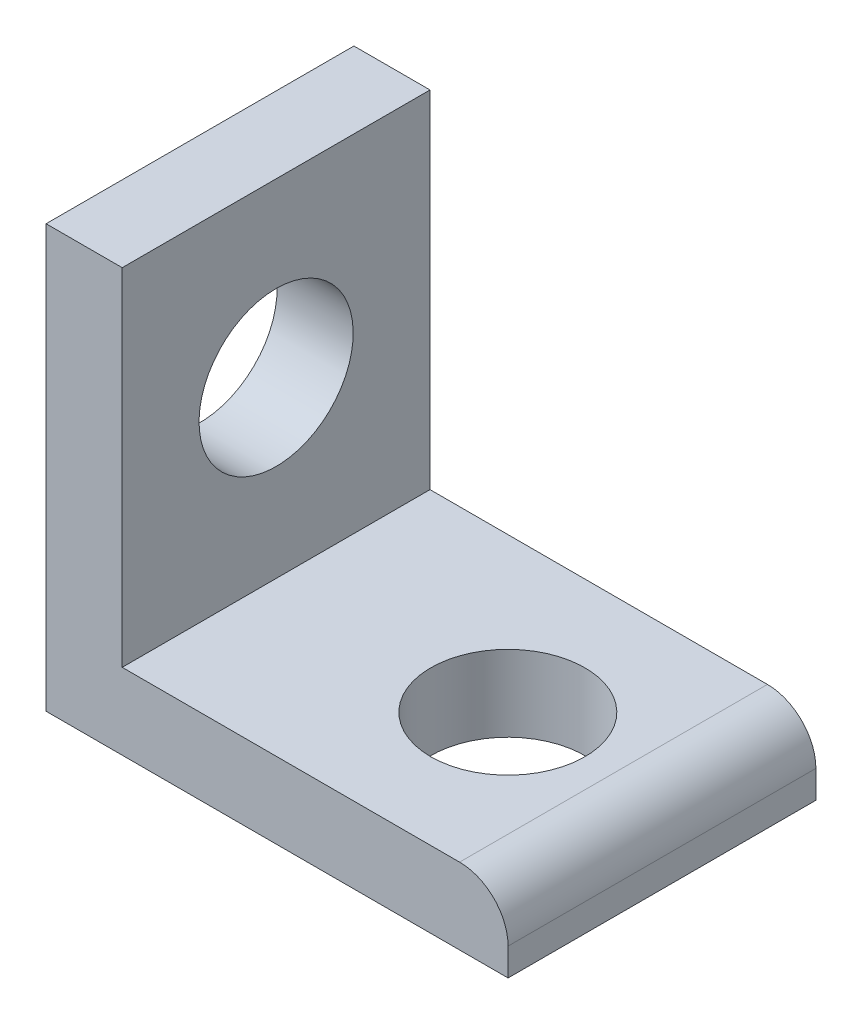
ISO-10303-21;
HEADER;
FILE_DESCRIPTION(('STEP AP214'),'2;1');
FILE_NAME('part.step','',(''),(''),'','','');
FILE_SCHEMA(('AUTOMOTIVE_DESIGN { 1 0 10303 214 1 1 1 1 }'));
ENDSEC;
DATA;
#1=APPLICATION_CONTEXT('core data for automotive mechanical design processes');
#2=APPLICATION_PROTOCOL_DEFINITION('international standard','automotive_design',2000,#1);
#3=PRODUCT_CONTEXT('',#1,'mechanical');
#4=PRODUCT('Part','Part','',(#3));
#5=PRODUCT_RELATED_PRODUCT_CATEGORY('part','',(#4));
#6=PRODUCT_DEFINITION_FORMATION('','',#4);
#7=PRODUCT_DEFINITION_CONTEXT('part definition',#1,'design');
#8=PRODUCT_DEFINITION('design','',#6,#7);
#9=PRODUCT_DEFINITION_SHAPE('','',#8);
#10=(LENGTH_UNIT() NAMED_UNIT(*) SI_UNIT(.MILLI.,.METRE.));
#11=(NAMED_UNIT(*) PLANE_ANGLE_UNIT() SI_UNIT($,.RADIAN.));
#12=(NAMED_UNIT(*) SI_UNIT($,.STERADIAN.) SOLID_ANGLE_UNIT());
#13=UNCERTAINTY_MEASURE_WITH_UNIT(LENGTH_MEASURE(1.E-05),#10,'distance_accuracy_value','');
#14=(GEOMETRIC_REPRESENTATION_CONTEXT(3) GLOBAL_UNCERTAINTY_ASSIGNED_CONTEXT((#13)) GLOBAL_UNIT_ASSIGNED_CONTEXT((#10,
#11,#12)) REPRESENTATION_CONTEXT('',''));
#15=CARTESIAN_POINT('',(0.,0.,0.));
#16=DIRECTION('',(0.,0.,1.));
#17=DIRECTION('',(1.,0.,0.));
#18=AXIS2_PLACEMENT_3D('',#15,#16,#17);
#19=CARTESIAN_POINT('',(0.,0.,6.35));
#20=DIRECTION('',(1.,0.,0.));
#21=DIRECTION('',(0.,0.,-1.));
#22=AXIS2_PLACEMENT_3D('',#19,#20,#21);
#23=PLANE('',#22);
#24=CARTESIAN_POINT('',(0.,5.16,3.175));
#25=DIRECTION('',(1.,0.,0.));
#26=DIRECTION('',(0.,0.,-1.));
#27=AXIS2_PLACEMENT_3D('',#24,#25,#26);
#28=CIRCLE('',#27,1.59);
#29=CARTESIAN_POINT('',(0.,6.75,3.175));
#30=VERTEX_POINT('',#29);
#31=EDGE_CURVE('E152',#30,#30,#28,.F.);
#32=ORIENTED_EDGE('',*,*,#31,.F.);
#33=EDGE_LOOP('',(#32));
#34=FACE_BOUND('',#33,.T.);
#35=DIRECTION('',(0.,-1.,0.));
#36=VECTOR('',#35,1.);
#37=CARTESIAN_POINT('',(0.,0.,0.));
#38=LINE('',#37,#36);
#39=CARTESIAN_POINT('',(0.,8.71,0.));
#40=VERTEX_POINT('',#39);
#41=CARTESIAN_POINT('',(0.,0.,0.));
#42=VERTEX_POINT('',#41);
#43=EDGE_CURVE('E114',#40,#42,#38,.T.);
#44=ORIENTED_EDGE('',*,*,#43,.T.);
#45=DIRECTION('',(0.,0.,-1.));
#46=VECTOR('',#45,1.);
#47=CARTESIAN_POINT('',(0.,0.,6.35));
#48=LINE('',#47,#46);
#49=CARTESIAN_POINT('',(0.,0.,6.35));
#50=VERTEX_POINT('',#49);
#51=EDGE_CURVE('E96',#50,#42,#48,.T.);
#52=ORIENTED_EDGE('',*,*,#51,.F.);
#53=DIRECTION('',(0.,-1.,0.));
#54=VECTOR('',#53,1.);
#55=CARTESIAN_POINT('',(0.,0.,6.35));
#56=LINE('',#55,#54);
#57=CARTESIAN_POINT('',(0.,8.71,6.35));
#58=VERTEX_POINT('',#57);
#59=EDGE_CURVE('E102',#58,#50,#56,.T.);
#60=ORIENTED_EDGE('',*,*,#59,.F.);
#61=DIRECTION('',(0.,0.,-1.));
#62=VECTOR('',#61,1.);
#63=CARTESIAN_POINT('',(0.,8.71,6.35));
#64=LINE('',#63,#62);
#65=EDGE_CURVE('E128',#58,#40,#64,.T.);
#66=ORIENTED_EDGE('',*,*,#65,.T.);
#67=EDGE_LOOP('',(#44,#52,#60,#66));
#68=FACE_BOUND('',#67,.T.);
#69=ADVANCED_FACE('F33',(#34,#68),#23,.F.);
#70=CARTESIAN_POINT('',(0.,0.,6.35));
#71=DIRECTION('',(0.,1.,0.));
#72=DIRECTION('',(0.,0.,1.));
#73=AXIS2_PLACEMENT_3D('',#70,#71,#72);
#74=PLANE('',#73);
#75=CARTESIAN_POINT('',(6.35,0.,3.175));
#76=DIRECTION('',(0.,1.,0.));
#77=DIRECTION('',(0.,0.,1.));
#78=AXIS2_PLACEMENT_3D('',#75,#76,#77);
#79=CIRCLE('',#78,1.59);
#80=CARTESIAN_POINT('',(6.35,0.,4.765));
#81=VERTEX_POINT('',#80);
#82=EDGE_CURVE('E140',#81,#81,#79,.F.);
#83=ORIENTED_EDGE('',*,*,#82,.F.);
#84=EDGE_LOOP('',(#83));
#85=FACE_BOUND('',#84,.T.);
#86=DIRECTION('',(1.,0.,0.));
#87=VECTOR('',#86,1.);
#88=CARTESIAN_POINT('',(0.,0.,0.));
#89=LINE('',#88,#87);
#90=CARTESIAN_POINT('',(9.53,0.,0.));
#91=VERTEX_POINT('',#90);
#92=EDGE_CURVE('E137',#42,#91,#89,.T.);
#93=ORIENTED_EDGE('',*,*,#92,.T.);
#94=DIRECTION('',(0.,0.,-1.));
#95=VECTOR('',#94,1.);
#96=CARTESIAN_POINT('',(9.53,0.,6.35));
#97=LINE('',#96,#95);
#98=CARTESIAN_POINT('',(9.53,0.,6.35));
#99=VERTEX_POINT('',#98);
#100=EDGE_CURVE('E99',#99,#91,#97,.T.);
#101=ORIENTED_EDGE('',*,*,#100,.F.);
#102=DIRECTION('',(1.,0.,0.));
#103=VECTOR('',#102,1.);
#104=CARTESIAN_POINT('',(0.,0.,6.35));
#105=LINE('',#104,#103);
#106=EDGE_CURVE('E92',#50,#99,#105,.T.);
#107=ORIENTED_EDGE('',*,*,#106,.F.);
#108=ORIENTED_EDGE('',*,*,#51,.T.);
#109=EDGE_LOOP('',(#93,#101,#107,#108));
#110=FACE_BOUND('',#109,.T.);
#111=ADVANCED_FACE('F94',(#85,#110),#74,.F.);
#112=CARTESIAN_POINT('',(9.53,1.57,6.35));
#113=DIRECTION('',(-1.,0.,0.));
#114=DIRECTION('',(0.,0.,1.));
#115=AXIS2_PLACEMENT_3D('',#112,#113,#114);
#116=PLANE('',#115);
#117=DIRECTION('',(0.,1.,0.));
#118=VECTOR('',#117,1.);
#119=CARTESIAN_POINT('',(9.53,1.57,0.));
#120=LINE('',#119,#118);
#121=CARTESIAN_POINT('',(9.53,0.57,0.));
#122=VERTEX_POINT('',#121);
#123=EDGE_CURVE('E135',#91,#122,#120,.T.);
#124=ORIENTED_EDGE('',*,*,#123,.T.);
#125=DIRECTION('',(0.,0.,-1.));
#126=VECTOR('',#125,1.);
#127=CARTESIAN_POINT('',(9.53,0.57,6.35));
#128=LINE('',#127,#126);
#129=CARTESIAN_POINT('',(9.53,0.57,6.35));
#130=VERTEX_POINT('',#129);
#131=EDGE_CURVE('E41',#122,#130,#128,.F.);
#132=ORIENTED_EDGE('',*,*,#131,.T.);
#133=DIRECTION('',(0.,1.,0.));
#134=VECTOR('',#133,1.);
#135=CARTESIAN_POINT('',(9.53,1.57,6.35));
#136=LINE('',#135,#134);
#137=EDGE_CURVE('E101',#99,#130,#136,.T.);
#138=ORIENTED_EDGE('',*,*,#137,.F.);
#139=ORIENTED_EDGE('',*,*,#100,.T.);
#140=EDGE_LOOP('',(#124,#132,#138,#139));
#141=FACE_BOUND('',#140,.T.);
#142=ADVANCED_FACE('F174',(#141),#116,.F.);
#143=CARTESIAN_POINT('',(1.57,1.57,6.35));
#144=DIRECTION('',(0.,-1.,0.));
#145=DIRECTION('',(0.,0.,-1.));
#146=AXIS2_PLACEMENT_3D('',#143,#144,#145);
#147=PLANE('',#146);
#148=CARTESIAN_POINT('',(6.35,1.57,3.175));
#149=DIRECTION('',(0.,1.,0.));
#150=DIRECTION('',(0.,0.,1.));
#151=AXIS2_PLACEMENT_3D('',#148,#149,#150);
#152=CIRCLE('',#151,1.59);
#153=CARTESIAN_POINT('',(6.35,1.57,4.765));
#154=VERTEX_POINT('',#153);
#155=EDGE_CURVE('E149',#154,#154,#152,.T.);
#156=ORIENTED_EDGE('',*,*,#155,.F.);
#157=EDGE_LOOP('',(#156));
#158=FACE_BOUND('',#157,.T.);
#159=DIRECTION('',(-1.,0.,0.));
#160=VECTOR('',#159,1.);
#161=CARTESIAN_POINT('',(1.57,1.57,6.35));
#162=LINE('',#161,#160);
#163=CARTESIAN_POINT('',(8.53,1.57,6.35));
#164=VERTEX_POINT('',#163);
#165=CARTESIAN_POINT('',(1.57,1.57,6.35));
#166=VERTEX_POINT('',#165);
#167=EDGE_CURVE('E144',#164,#166,#162,.T.);
#168=ORIENTED_EDGE('',*,*,#167,.F.);
#169=DIRECTION('',(0.,0.,-1.));
#170=VECTOR('',#169,1.);
#171=CARTESIAN_POINT('',(8.53,1.57,6.35));
#172=LINE('',#171,#170);
#173=CARTESIAN_POINT('',(8.53,1.57,0.));
#174=VERTEX_POINT('',#173);
#175=EDGE_CURVE('E115',#164,#174,#172,.T.);
#176=ORIENTED_EDGE('',*,*,#175,.T.);
#177=DIRECTION('',(-1.,0.,0.));
#178=VECTOR('',#177,1.);
#179=CARTESIAN_POINT('',(1.57,1.57,0.));
#180=LINE('',#179,#178);
#181=CARTESIAN_POINT('',(1.57,1.57,0.));
#182=VERTEX_POINT('',#181);
#183=EDGE_CURVE('E133',#174,#182,#180,.T.);
#184=ORIENTED_EDGE('',*,*,#183,.T.);
#185=DIRECTION('',(0.,0.,-1.));
#186=VECTOR('',#185,1.);
#187=CARTESIAN_POINT('',(1.57,1.57,6.35));
#188=LINE('',#187,#186);
#189=EDGE_CURVE('E119',#166,#182,#188,.T.);
#190=ORIENTED_EDGE('',*,*,#189,.F.);
#191=EDGE_LOOP('',(#168,#176,#184,#190));
#192=FACE_BOUND('',#191,.T.);
#193=ADVANCED_FACE('F165',(#158,#192),#147,.F.);
#194=CARTESIAN_POINT('',(1.57,8.71,6.35));
#195=DIRECTION('',(-1.,0.,0.));
#196=DIRECTION('',(0.,-1.,0.));
#197=AXIS2_PLACEMENT_3D('',#194,#195,#196);
#198=PLANE('',#197);
#199=CARTESIAN_POINT('',(1.57,5.16,3.175));
#200=DIRECTION('',(1.,0.,0.));
#201=DIRECTION('',(0.,1.,0.));
#202=AXIS2_PLACEMENT_3D('',#199,#200,#201);
#203=CIRCLE('',#202,1.59);
#204=CARTESIAN_POINT('',(1.57,6.75,3.175));
#205=VERTEX_POINT('',#204);
#206=EDGE_CURVE('E155',#205,#205,#203,.T.);
#207=ORIENTED_EDGE('',*,*,#206,.F.);
#208=EDGE_LOOP('',(#207));
#209=FACE_BOUND('',#208,.T.);
#210=DIRECTION('',(0.,1.,0.));
#211=VECTOR('',#210,1.);
#212=CARTESIAN_POINT('',(1.57,8.71,0.));
#213=LINE('',#212,#211);
#214=CARTESIAN_POINT('',(1.57,8.71,0.));
#215=VERTEX_POINT('',#214);
#216=EDGE_CURVE('E131',#182,#215,#213,.T.);
#217=ORIENTED_EDGE('',*,*,#216,.T.);
#218=DIRECTION('',(0.,0.,-1.));
#219=VECTOR('',#218,1.);
#220=CARTESIAN_POINT('',(1.57,8.71,6.35));
#221=LINE('',#220,#219);
#222=CARTESIAN_POINT('',(1.57,8.71,6.35));
#223=VERTEX_POINT('',#222);
#224=EDGE_CURVE('E125',#223,#215,#221,.T.);
#225=ORIENTED_EDGE('',*,*,#224,.F.);
#226=DIRECTION('',(0.,1.,0.));
#227=VECTOR('',#226,1.);
#228=CARTESIAN_POINT('',(1.57,8.71,6.35));
#229=LINE('',#228,#227);
#230=EDGE_CURVE('E142',#166,#223,#229,.T.);
#231=ORIENTED_EDGE('',*,*,#230,.F.);
#232=ORIENTED_EDGE('',*,*,#189,.T.);
#233=EDGE_LOOP('',(#217,#225,#231,#232));
#234=FACE_BOUND('',#233,.T.);
#235=ADVANCED_FACE('F161',(#209,#234),#198,.F.);
#236=CARTESIAN_POINT('',(0.,8.71,6.35));
#237=DIRECTION('',(0.,-1.,0.));
#238=DIRECTION('',(0.,0.,-1.));
#239=AXIS2_PLACEMENT_3D('',#236,#237,#238);
#240=PLANE('',#239);
#241=DIRECTION('',(-1.,0.,0.));
#242=VECTOR('',#241,1.);
#243=CARTESIAN_POINT('',(0.,8.71,0.));
#244=LINE('',#243,#242);
#245=EDGE_CURVE('E111',#215,#40,#244,.T.);
#246=ORIENTED_EDGE('',*,*,#245,.T.);
#247=ORIENTED_EDGE('',*,*,#65,.F.);
#248=DIRECTION('',(-1.,0.,0.));
#249=VECTOR('',#248,1.);
#250=CARTESIAN_POINT('',(0.,8.71,6.35));
#251=LINE('',#250,#249);
#252=EDGE_CURVE('E107',#223,#58,#251,.T.);
#253=ORIENTED_EDGE('',*,*,#252,.F.);
#254=ORIENTED_EDGE('',*,*,#224,.T.);
#255=EDGE_LOOP('',(#246,#247,#253,#254));
#256=FACE_BOUND('',#255,.T.);
#257=ADVANCED_FACE('F164',(#256),#240,.F.);
#258=CARTESIAN_POINT('',(0.,0.,6.35));
#259=DIRECTION('',(0.,0.,-1.));
#260=DIRECTION('',(-1.,0.,0.));
#261=AXIS2_PLACEMENT_3D('',#258,#259,#260);
#262=PLANE('',#261);
#263=ORIENTED_EDGE('',*,*,#137,.T.);
#264=CARTESIAN_POINT('',(8.53,0.57,6.35));
#265=DIRECTION('',(0.,0.,-1.));
#266=DIRECTION('',(-1.,0.,0.));
#267=AXIS2_PLACEMENT_3D('',#264,#265,#266);
#268=CIRCLE('',#267,1.);
#269=EDGE_CURVE('E11',#130,#164,#268,.F.);
#270=ORIENTED_EDGE('',*,*,#269,.T.);
#271=ORIENTED_EDGE('',*,*,#167,.T.);
#272=ORIENTED_EDGE('',*,*,#230,.T.);
#273=ORIENTED_EDGE('',*,*,#252,.T.);
#274=ORIENTED_EDGE('',*,*,#59,.T.);
#275=ORIENTED_EDGE('',*,*,#106,.T.);
#276=EDGE_LOOP('',(#263,#270,#271,#272,#273,#274,#275));
#277=FACE_BOUND('',#276,.T.);
#278=ADVANCED_FACE('F105',(#277),#262,.F.);
#279=CARTESIAN_POINT('',(0.,0.,0.));
#280=DIRECTION('',(0.,0.,-1.));
#281=DIRECTION('',(-1.,0.,0.));
#282=AXIS2_PLACEMENT_3D('',#279,#280,#281);
#283=PLANE('',#282);
#284=ORIENTED_EDGE('',*,*,#183,.F.);
#285=CARTESIAN_POINT('',(8.53,0.57,0.));
#286=DIRECTION('',(0.,0.,-1.));
#287=DIRECTION('',(-1.,0.,0.));
#288=AXIS2_PLACEMENT_3D('',#285,#286,#287);
#289=CIRCLE('',#288,1.);
#290=EDGE_CURVE('E55',#174,#122,#289,.T.);
#291=ORIENTED_EDGE('',*,*,#290,.T.);
#292=ORIENTED_EDGE('',*,*,#123,.F.);
#293=ORIENTED_EDGE('',*,*,#92,.F.);
#294=ORIENTED_EDGE('',*,*,#43,.F.);
#295=ORIENTED_EDGE('',*,*,#245,.F.);
#296=ORIENTED_EDGE('',*,*,#216,.F.);
#297=EDGE_LOOP('',(#284,#291,#292,#293,#294,#295,#296));
#298=FACE_BOUND('',#297,.T.);
#299=ADVANCED_FACE('F173',(#298),#283,.T.);
#300=CARTESIAN_POINT('',(6.35,-4.49719912834644,3.175));
#301=DIRECTION('',(0.,1.,0.));
#302=DIRECTION('',(0.,0.,1.));
#303=AXIS2_PLACEMENT_3D('',#300,#301,#302);
#304=CYLINDRICAL_SURFACE('',#303,1.59);
#305=ORIENTED_EDGE('',*,*,#82,.T.);
#306=EDGE_LOOP('',(#305));
#307=FACE_BOUND('',#306,.T.);
#308=ORIENTED_EDGE('',*,*,#155,.T.);
#309=EDGE_LOOP('',(#308));
#310=FACE_BOUND('',#309,.T.);
#311=ADVANCED_FACE('F198',(#307,#310),#304,.F.);
#312=CARTESIAN_POINT('',(-4.49719912834644,5.16,3.175));
#313=DIRECTION('',(1.,0.,0.));
#314=DIRECTION('',(0.,1.,0.));
#315=AXIS2_PLACEMENT_3D('',#312,#313,#314);
#316=CYLINDRICAL_SURFACE('',#315,1.59);
#317=CARTESIAN_POINT('',(0.,6.75,3.175));
#318=CARTESIAN_POINT('',(0.0163541666666665,6.75,3.175));
#319=CARTESIAN_POINT('',(0.0327083333333331,6.75,3.175));
#320=CARTESIAN_POINT('',(0.0654166666666665,6.75,3.175));
#321=CARTESIAN_POINT('',(0.0817708333333333,6.75,3.175));
#322=CARTESIAN_POINT('',(0.114479166666667,6.75,3.175));
#323=CARTESIAN_POINT('',(0.130833333333333,6.75,3.175));
#324=CARTESIAN_POINT('',(0.163541666666667,6.75,3.175));
#325=CARTESIAN_POINT('',(0.179895833333333,6.75,3.175));
#326=CARTESIAN_POINT('',(0.212604166666667,6.75,3.175));
#327=CARTESIAN_POINT('',(0.228958333333333,6.75,3.175));
#328=CARTESIAN_POINT('',(0.261666666666667,6.75,3.175));
#329=CARTESIAN_POINT('',(0.278020833333333,6.75,3.175));
#330=CARTESIAN_POINT('',(0.310729166666667,6.75,3.175));
#331=CARTESIAN_POINT('',(0.327083333333333,6.75,3.175));
#332=CARTESIAN_POINT('',(0.359791666666667,6.75,3.175));
#333=CARTESIAN_POINT('',(0.376145833333334,6.75,3.175));
#334=CARTESIAN_POINT('',(0.408854166666667,6.75,3.175));
#335=CARTESIAN_POINT('',(0.425208333333334,6.75,3.175));
#336=CARTESIAN_POINT('',(0.457916666666667,6.75,3.175));
#337=CARTESIAN_POINT('',(0.474270833333333,6.75,3.175));
#338=CARTESIAN_POINT('',(0.506979166666667,6.75,3.175));
#339=CARTESIAN_POINT('',(0.523333333333333,6.75,3.175));
#340=CARTESIAN_POINT('',(0.556041666666667,6.75,3.175));
#341=CARTESIAN_POINT('',(0.572395833333333,6.75,3.175));
#342=CARTESIAN_POINT('',(0.605104166666667,6.75,3.175));
#343=CARTESIAN_POINT('',(0.621458333333334,6.75,3.175));
#344=CARTESIAN_POINT('',(0.654166666666667,6.75,3.175));
#345=CARTESIAN_POINT('',(0.670520833333333,6.75,3.175));
#346=CARTESIAN_POINT('',(0.703229166666667,6.75,3.175));
#347=CARTESIAN_POINT('',(0.719583333333334,6.75,3.175));
#348=CARTESIAN_POINT('',(0.752291666666667,6.75,3.175));
#349=CARTESIAN_POINT('',(0.768645833333334,6.75,3.175));
#350=CARTESIAN_POINT('',(0.801354166666667,6.75,3.175));
#351=CARTESIAN_POINT('',(0.817708333333333,6.75,3.175));
#352=CARTESIAN_POINT('',(0.850416666666666,6.75,3.175));
#353=CARTESIAN_POINT('',(0.866770833333333,6.75,3.175));
#354=CARTESIAN_POINT('',(0.899479166666667,6.75,3.175));
#355=CARTESIAN_POINT('',(0.915833333333333,6.75,3.175));
#356=CARTESIAN_POINT('',(0.948541666666667,6.75,3.175));
#357=CARTESIAN_POINT('',(0.964895833333334,6.75,3.175));
#358=CARTESIAN_POINT('',(0.997604166666667,6.75,3.175));
#359=CARTESIAN_POINT('',(1.01395833333333,6.75,3.175));
#360=CARTESIAN_POINT('',(1.04666666666667,6.75,3.175));
#361=CARTESIAN_POINT('',(1.06302083333333,6.75,3.175));
#362=CARTESIAN_POINT('',(1.09572916666667,6.75,3.175));
#363=CARTESIAN_POINT('',(1.11208333333333,6.75,3.175));
#364=CARTESIAN_POINT('',(1.14479166666667,6.75,3.175));
#365=CARTESIAN_POINT('',(1.16114583333333,6.75,3.175));
#366=CARTESIAN_POINT('',(1.19385416666667,6.75,3.175));
#367=CARTESIAN_POINT('',(1.21020833333333,6.75,3.175));
#368=CARTESIAN_POINT('',(1.24291666666667,6.75,3.175));
#369=CARTESIAN_POINT('',(1.25927083333333,6.75,3.175));
#370=CARTESIAN_POINT('',(1.29197916666667,6.75,3.175));
#371=CARTESIAN_POINT('',(1.30833333333333,6.75,3.175));
#372=CARTESIAN_POINT('',(1.34104166666667,6.75,3.175));
#373=CARTESIAN_POINT('',(1.35739583333333,6.75,3.175));
#374=CARTESIAN_POINT('',(1.39010416666667,6.75,3.175));
#375=CARTESIAN_POINT('',(1.40645833333333,6.75,3.175));
#376=CARTESIAN_POINT('',(1.43916666666667,6.75,3.175));
#377=CARTESIAN_POINT('',(1.45552083333333,6.75,3.175));
#378=CARTESIAN_POINT('',(1.48822916666667,6.75,3.175));
#379=CARTESIAN_POINT('',(1.50458333333333,6.75,3.175));
#380=CARTESIAN_POINT('',(1.53729166666667,6.75,3.175));
#381=CARTESIAN_POINT('',(1.55364583333333,6.75,3.175));
#382=CARTESIAN_POINT('',(1.57,6.75,3.175));
#383=B_SPLINE_CURVE_WITH_KNOTS('',3,(#317,#318,#319,#320,#321,#322,#323,#324,#325,#326,#327,
#328,#329,#330,#331,#332,#333,#334,#335,#336,#337,#338,#339,#340,#341,#342,#343,#344,#345,#346,
#347,#348,#349,#350,#351,#352,#353,#354,#355,#356,#357,#358,#359,#360,#361,#362,#363,#364,#365,
#366,#367,#368,#369,#370,#371,#372,#373,#374,#375,#376,#377,#378,#379,#380,#381,#382),
.UNSPECIFIED.,.F.,.F.,(4,2,2,2,2,2,2,2,2,2,2,2,2,2,2,2,2,2,2,2,2,2,2,2,2,2,2,2,2,2,2,2,4),(0.,
0.0490624999999996,0.0981250000000001,0.1471875,0.19625,0.2453125,0.294375,0.3434375,
0.392500000000001,0.4415625,0.490625,0.5396875,0.58875,0.6378125,0.686875,0.7359375,0.785,
0.8340625,0.883125,0.9321875,0.98125,1.0303125,1.079375,1.1284375,1.1775,1.2265625,1.275625,
1.3246875,1.37375,1.4228125,1.471875,1.5209375,1.57),.UNSPECIFIED.);
#384=EDGE_CURVE('BSEAM159',#30,#205,#383,.T.);
#385=ORIENTED_EDGE('',*,*,#31,.T.);
#386=ORIENTED_EDGE('',*,*,#206,.T.);
#387=ORIENTED_EDGE('',*,*,#384,.T.);
#388=ORIENTED_EDGE('',*,*,#384,.F.);
#389=EDGE_LOOP('',(#385,#387,#386,#388));
#390=FACE_BOUND('',#389,.T.);
#391=ADVANCED_FACE('F159',(#390),#316,.F.);
#392=CARTESIAN_POINT('',(8.53,0.57,6.35));
#393=DIRECTION('',(0.,0.,-1.));
#394=DIRECTION('',(-1.,0.,0.));
#395=AXIS2_PLACEMENT_3D('',#392,#393,#394);
#396=CYLINDRICAL_SURFACE('',#395,1.);
#397=ORIENTED_EDGE('',*,*,#269,.F.);
#398=ORIENTED_EDGE('',*,*,#131,.F.);
#399=ORIENTED_EDGE('',*,*,#290,.F.);
#400=ORIENTED_EDGE('',*,*,#175,.F.);
#401=EDGE_LOOP('',(#397,#398,#399,#400));
#402=FACE_BOUND('',#401,.T.);
#403=ADVANCED_FACE('F35',(#402),#396,.T.);
#404=CLOSED_SHELL('',(#69,#111,#142,#193,#235,#257,#278,#299,#311,#391,#403));
#405=MANIFOLD_SOLID_BREP('B2',#404);
#406=ADVANCED_BREP_SHAPE_REPRESENTATION('',(#18,#405),#14);
#407=SHAPE_DEFINITION_REPRESENTATION(#9,#406);
ENDSEC;
END-ISO-10303-21;
